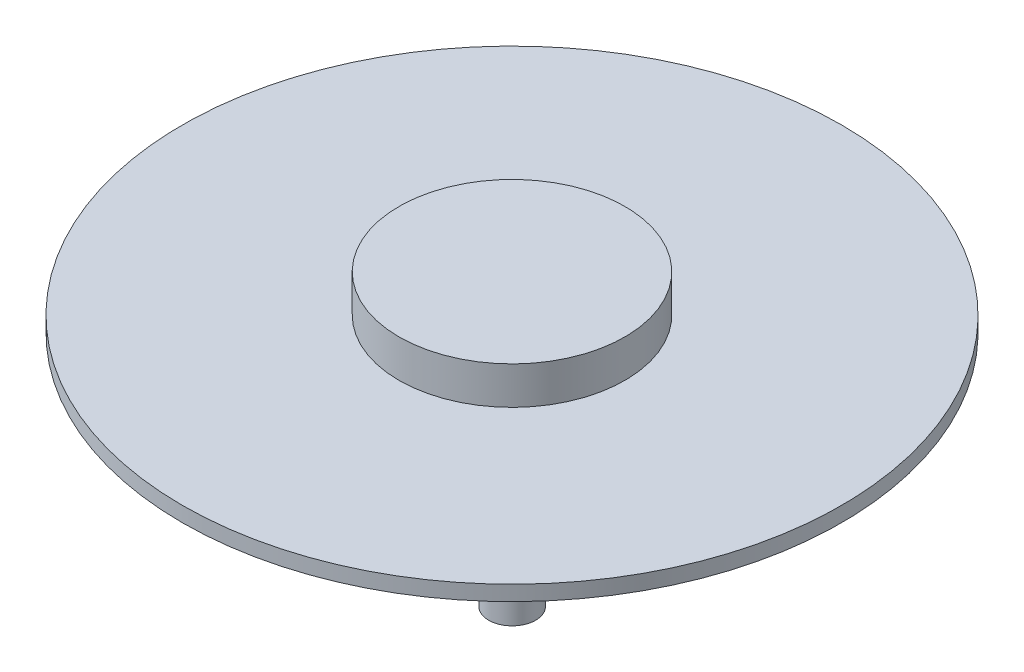
ISO-10303-21;
HEADER;
FILE_DESCRIPTION(('STEP AP214'),'2;1');
FILE_NAME('part.step','',(''),(''),'','','');
FILE_SCHEMA(('AUTOMOTIVE_DESIGN { 1 0 10303 214 1 1 1 1 }'));
ENDSEC;
DATA;
#1=APPLICATION_CONTEXT('core data for automotive mechanical design processes');
#2=APPLICATION_PROTOCOL_DEFINITION('international standard','automotive_design',2000,#1);
#3=PRODUCT_CONTEXT('',#1,'mechanical');
#4=PRODUCT('Part','Part','',(#3));
#5=PRODUCT_RELATED_PRODUCT_CATEGORY('part','',(#4));
#6=PRODUCT_DEFINITION_FORMATION('','',#4);
#7=PRODUCT_DEFINITION_CONTEXT('part definition',#1,'design');
#8=PRODUCT_DEFINITION('design','',#6,#7);
#9=PRODUCT_DEFINITION_SHAPE('','',#8);
#10=(LENGTH_UNIT() NAMED_UNIT(*) SI_UNIT(.MILLI.,.METRE.));
#11=(NAMED_UNIT(*) PLANE_ANGLE_UNIT() SI_UNIT($,.RADIAN.));
#12=(NAMED_UNIT(*) SI_UNIT($,.STERADIAN.) SOLID_ANGLE_UNIT());
#13=UNCERTAINTY_MEASURE_WITH_UNIT(LENGTH_MEASURE(1.E-05),#10,'distance_accuracy_value','');
#14=(GEOMETRIC_REPRESENTATION_CONTEXT(3) GLOBAL_UNCERTAINTY_ASSIGNED_CONTEXT((#13)) GLOBAL_UNIT_ASSIGNED_CONTEXT((#10,
#11,#12)) REPRESENTATION_CONTEXT('',''));
#15=CARTESIAN_POINT('',(0.,0.,0.));
#16=DIRECTION('',(0.,0.,1.));
#17=DIRECTION('',(1.,0.,0.));
#18=AXIS2_PLACEMENT_3D('',#15,#16,#17);
#19=CARTESIAN_POINT('',(21.222,4.,21.205));
#20=DIRECTION('',(0.,-1.,0.));
#21=DIRECTION('',(0.,0.,-1.));
#22=AXIS2_PLACEMENT_3D('',#19,#20,#21);
#23=CYLINDRICAL_SURFACE('',#22,2.5);
#24=CARTESIAN_POINT('',(21.222,4.,21.205));
#25=DIRECTION('',(0.,1.,0.));
#26=DIRECTION('',(0.,0.,1.));
#27=AXIS2_PLACEMENT_3D('',#24,#25,#26);
#28=CIRCLE('',#27,2.5);
#29=CARTESIAN_POINT('',(21.222,4.,23.705));
#30=VERTEX_POINT('',#29);
#31=EDGE_CURVE('E75',#30,#30,#28,.T.);
#32=ORIENTED_EDGE('',*,*,#31,.F.);
#33=EDGE_LOOP('',(#32));
#34=FACE_BOUND('',#33,.T.);
#35=CARTESIAN_POINT('',(21.222,0.,21.205));
#36=DIRECTION('',(0.,1.,0.));
#37=DIRECTION('',(0.,0.,1.));
#38=AXIS2_PLACEMENT_3D('',#35,#36,#37);
#39=CIRCLE('',#38,2.5);
#40=CARTESIAN_POINT('',(21.222,0.,23.705));
#41=VERTEX_POINT('',#40);
#42=EDGE_CURVE('E66',#41,#41,#39,.T.);
#43=ORIENTED_EDGE('',*,*,#42,.T.);
#44=EDGE_LOOP('',(#43));
#45=FACE_BOUND('',#44,.T.);
#46=ADVANCED_FACE('F41',(#34,#45),#23,.T.);
#47=CARTESIAN_POINT('',(21.222,0.,21.205));
#48=DIRECTION('',(0.,1.,0.));
#49=DIRECTION('',(0.,0.,1.));
#50=AXIS2_PLACEMENT_3D('',#47,#48,#49);
#51=PLANE('',#50);
#52=ORIENTED_EDGE('',*,*,#42,.F.);
#53=EDGE_LOOP('',(#52));
#54=FACE_BOUND('',#53,.T.);
#55=ADVANCED_FACE('F99',(#54),#51,.F.);
#56=CARTESIAN_POINT('',(0.,5.6,0.));
#57=DIRECTION('',(0.,-1.,0.));
#58=DIRECTION('',(0.,0.,-1.));
#59=AXIS2_PLACEMENT_3D('',#56,#57,#58);
#60=CYLINDRICAL_SURFACE('',#59,35.);
#61=CARTESIAN_POINT('',(0.,5.6,0.));
#62=DIRECTION('',(0.,1.,0.));
#63=DIRECTION('',(0.,0.,1.));
#64=AXIS2_PLACEMENT_3D('',#61,#62,#63);
#65=CIRCLE('',#64,35.);
#66=CARTESIAN_POINT('',(0.,5.6,35.));
#67=VERTEX_POINT('',#66);
#68=EDGE_CURVE('E67',#67,#67,#65,.T.);
#69=ORIENTED_EDGE('',*,*,#68,.F.);
#70=EDGE_LOOP('',(#69));
#71=FACE_BOUND('',#70,.T.);
#72=CARTESIAN_POINT('',(0.,4.,0.));
#73=DIRECTION('',(0.,1.,0.));
#74=DIRECTION('',(0.,0.,1.));
#75=AXIS2_PLACEMENT_3D('',#72,#73,#74);
#76=CIRCLE('',#75,35.);
#77=CARTESIAN_POINT('',(0.,4.,35.));
#78=VERTEX_POINT('',#77);
#79=EDGE_CURVE('E64',#78,#78,#76,.T.);
#80=ORIENTED_EDGE('',*,*,#79,.T.);
#81=EDGE_LOOP('',(#80));
#82=FACE_BOUND('',#81,.T.);
#83=ADVANCED_FACE('F98',(#71,#82),#60,.T.);
#84=CARTESIAN_POINT('',(0.,5.6,0.));
#85=DIRECTION('',(0.,1.,0.));
#86=DIRECTION('',(0.,0.,1.));
#87=AXIS2_PLACEMENT_3D('',#84,#85,#86);
#88=PLANE('',#87);
#89=CARTESIAN_POINT('',(0.,5.6,0.));
#90=DIRECTION('',(0.,1.,0.));
#91=DIRECTION('',(0.,0.,1.));
#92=AXIS2_PLACEMENT_3D('',#89,#90,#91);
#93=CIRCLE('',#92,12.);
#94=CARTESIAN_POINT('',(0.,5.6,12.));
#95=VERTEX_POINT('',#94);
#96=EDGE_CURVE('E10',#95,#95,#93,.T.);
#97=ORIENTED_EDGE('',*,*,#96,.F.);
#98=EDGE_LOOP('',(#97));
#99=FACE_BOUND('',#98,.T.);
#100=ORIENTED_EDGE('',*,*,#68,.T.);
#101=EDGE_LOOP('',(#100));
#102=FACE_BOUND('',#101,.T.);
#103=ADVANCED_FACE('F90',(#99,#102),#88,.T.);
#104=CARTESIAN_POINT('',(0.,4.,0.));
#105=DIRECTION('',(0.,1.,0.));
#106=DIRECTION('',(0.,0.,1.));
#107=AXIS2_PLACEMENT_3D('',#104,#105,#106);
#108=PLANE('',#107);
#109=CARTESIAN_POINT('',(21.218,4.,-21.209));
#110=DIRECTION('',(0.,1.,0.));
#111=DIRECTION('',(0.,0.,1.));
#112=AXIS2_PLACEMENT_3D('',#109,#110,#111);
#113=CIRCLE('',#112,2.5);
#114=CARTESIAN_POINT('',(21.218,4.,-18.709));
#115=VERTEX_POINT('',#114);
#116=EDGE_CURVE('E42',#115,#115,#113,.F.);
#117=ORIENTED_EDGE('',*,*,#116,.F.);
#118=EDGE_LOOP('',(#117));
#119=FACE_BOUND('',#118,.T.);
#120=CARTESIAN_POINT('',(-21.213,4.,-21.213));
#121=DIRECTION('',(0.,1.,0.));
#122=DIRECTION('',(0.,0.,1.));
#123=AXIS2_PLACEMENT_3D('',#120,#121,#122);
#124=CIRCLE('',#123,2.5);
#125=CARTESIAN_POINT('',(-21.213,4.,-18.713));
#126=VERTEX_POINT('',#125);
#127=EDGE_CURVE('E55',#126,#126,#124,.F.);
#128=ORIENTED_EDGE('',*,*,#127,.F.);
#129=EDGE_LOOP('',(#128));
#130=FACE_BOUND('',#129,.T.);
#131=CARTESIAN_POINT('',(-21.209,4.,21.217));
#132=DIRECTION('',(0.,1.,0.));
#133=DIRECTION('',(0.,0.,1.));
#134=AXIS2_PLACEMENT_3D('',#131,#132,#133);
#135=CIRCLE('',#134,2.5);
#136=CARTESIAN_POINT('',(-21.209,4.,23.717));
#137=VERTEX_POINT('',#136);
#138=EDGE_CURVE('E73',#137,#137,#135,.F.);
#139=ORIENTED_EDGE('',*,*,#138,.F.);
#140=EDGE_LOOP('',(#139));
#141=FACE_BOUND('',#140,.T.);
#142=ORIENTED_EDGE('',*,*,#31,.T.);
#143=EDGE_LOOP('',(#142));
#144=FACE_BOUND('',#143,.T.);
#145=ORIENTED_EDGE('',*,*,#79,.F.);
#146=EDGE_LOOP('',(#145));
#147=FACE_BOUND('',#146,.T.);
#148=ADVANCED_FACE('F83',(#119,#130,#141,#144,#147),#108,.F.);
#149=CARTESIAN_POINT('',(-21.209,4.,21.217));
#150=DIRECTION('',(0.,-1.,0.));
#151=DIRECTION('',(0.,0.,-1.));
#152=AXIS2_PLACEMENT_3D('',#149,#150,#151);
#153=CYLINDRICAL_SURFACE('',#152,2.5);
#154=ORIENTED_EDGE('',*,*,#138,.T.);
#155=EDGE_LOOP('',(#154));
#156=FACE_BOUND('',#155,.T.);
#157=CARTESIAN_POINT('',(-21.209,0.,21.217));
#158=DIRECTION('',(0.,1.,0.));
#159=DIRECTION('',(0.,0.,1.));
#160=AXIS2_PLACEMENT_3D('',#157,#158,#159);
#161=CIRCLE('',#160,2.5);
#162=CARTESIAN_POINT('',(-21.209,0.,23.717));
#163=VERTEX_POINT('',#162);
#164=EDGE_CURVE('E65',#163,#163,#161,.T.);
#165=ORIENTED_EDGE('',*,*,#164,.T.);
#166=EDGE_LOOP('',(#165));
#167=FACE_BOUND('',#166,.T.);
#168=ADVANCED_FACE('F86',(#156,#167),#153,.T.);
#169=CARTESIAN_POINT('',(-21.209,0.,21.217));
#170=DIRECTION('',(0.,1.,0.));
#171=DIRECTION('',(0.,0.,1.));
#172=AXIS2_PLACEMENT_3D('',#169,#170,#171);
#173=PLANE('',#172);
#174=ORIENTED_EDGE('',*,*,#164,.F.);
#175=EDGE_LOOP('',(#174));
#176=FACE_BOUND('',#175,.T.);
#177=ADVANCED_FACE('F146',(#176),#173,.F.);
#178=CARTESIAN_POINT('',(-21.213,4.,-21.213));
#179=DIRECTION('',(0.,-1.,0.));
#180=DIRECTION('',(0.,0.,-1.));
#181=AXIS2_PLACEMENT_3D('',#178,#179,#180);
#182=CYLINDRICAL_SURFACE('',#181,2.5);
#183=ORIENTED_EDGE('',*,*,#127,.T.);
#184=EDGE_LOOP('',(#183));
#185=FACE_BOUND('',#184,.T.);
#186=CARTESIAN_POINT('',(-21.213,0.,-21.213));
#187=DIRECTION('',(0.,1.,0.));
#188=DIRECTION('',(0.,0.,1.));
#189=AXIS2_PLACEMENT_3D('',#186,#187,#188);
#190=CIRCLE('',#189,2.5);
#191=CARTESIAN_POINT('',(-21.213,0.,-18.713));
#192=VERTEX_POINT('',#191);
#193=EDGE_CURVE('E56',#192,#192,#190,.T.);
#194=ORIENTED_EDGE('',*,*,#193,.T.);
#195=EDGE_LOOP('',(#194));
#196=FACE_BOUND('',#195,.T.);
#197=ADVANCED_FACE('F85',(#185,#196),#182,.T.);
#198=CARTESIAN_POINT('',(-21.213,0.,-21.213));
#199=DIRECTION('',(0.,1.,0.));
#200=DIRECTION('',(0.,0.,1.));
#201=AXIS2_PLACEMENT_3D('',#198,#199,#200);
#202=PLANE('',#201);
#203=ORIENTED_EDGE('',*,*,#193,.F.);
#204=EDGE_LOOP('',(#203));
#205=FACE_BOUND('',#204,.T.);
#206=ADVANCED_FACE('F170',(#205),#202,.F.);
#207=CARTESIAN_POINT('',(21.218,4.,-21.209));
#208=DIRECTION('',(0.,-1.,0.));
#209=DIRECTION('',(0.,0.,-1.));
#210=AXIS2_PLACEMENT_3D('',#207,#208,#209);
#211=CYLINDRICAL_SURFACE('',#210,2.5);
#212=ORIENTED_EDGE('',*,*,#116,.T.);
#213=EDGE_LOOP('',(#212));
#214=FACE_BOUND('',#213,.T.);
#215=CARTESIAN_POINT('',(21.218,0.,-21.209));
#216=DIRECTION('',(0.,1.,0.));
#217=DIRECTION('',(0.,0.,1.));
#218=AXIS2_PLACEMENT_3D('',#215,#216,#217);
#219=CIRCLE('',#218,2.5);
#220=CARTESIAN_POINT('',(21.218,0.,-18.709));
#221=VERTEX_POINT('',#220);
#222=EDGE_CURVE('E57',#221,#221,#219,.T.);
#223=ORIENTED_EDGE('',*,*,#222,.T.);
#224=EDGE_LOOP('',(#223));
#225=FACE_BOUND('',#224,.T.);
#226=ADVANCED_FACE('F177',(#214,#225),#211,.T.);
#227=CARTESIAN_POINT('',(21.218,0.,-21.209));
#228=DIRECTION('',(0.,1.,0.));
#229=DIRECTION('',(0.,0.,1.));
#230=AXIS2_PLACEMENT_3D('',#227,#228,#229);
#231=PLANE('',#230);
#232=ORIENTED_EDGE('',*,*,#222,.F.);
#233=EDGE_LOOP('',(#232));
#234=FACE_BOUND('',#233,.T.);
#235=ADVANCED_FACE('F186',(#234),#231,.F.);
#236=CARTESIAN_POINT('',(0.,9.6,0.));
#237=DIRECTION('',(0.,-1.,0.));
#238=DIRECTION('',(0.,0.,-1.));
#239=AXIS2_PLACEMENT_3D('',#236,#237,#238);
#240=CYLINDRICAL_SURFACE('',#239,12.);
#241=CARTESIAN_POINT('',(0.,9.6,0.));
#242=DIRECTION('',(0.,1.,0.));
#243=DIRECTION('',(0.,0.,1.));
#244=AXIS2_PLACEMENT_3D('',#241,#242,#243);
#245=CIRCLE('',#244,12.);
#246=CARTESIAN_POINT('',(0.,9.6,12.));
#247=VERTEX_POINT('',#246);
#248=EDGE_CURVE('E54',#247,#247,#245,.T.);
#249=ORIENTED_EDGE('',*,*,#248,.F.);
#250=EDGE_LOOP('',(#249));
#251=FACE_BOUND('',#250,.T.);
#252=ORIENTED_EDGE('',*,*,#96,.T.);
#253=EDGE_LOOP('',(#252));
#254=FACE_BOUND('',#253,.T.);
#255=ADVANCED_FACE('F193',(#251,#254),#240,.T.);
#256=CARTESIAN_POINT('',(0.,9.6,0.));
#257=DIRECTION('',(0.,1.,0.));
#258=DIRECTION('',(0.,0.,1.));
#259=AXIS2_PLACEMENT_3D('',#256,#257,#258);
#260=PLANE('',#259);
#261=ORIENTED_EDGE('',*,*,#248,.T.);
#262=EDGE_LOOP('',(#261));
#263=FACE_BOUND('',#262,.T.);
#264=ADVANCED_FACE('F204',(#263),#260,.T.);
#265=CLOSED_SHELL('',(#46,#55,#83,#103,#148,#168,#177,#197,#206,#226,#235,#255,#264));
#266=MANIFOLD_SOLID_BREP('B2',#265);
#267=ADVANCED_BREP_SHAPE_REPRESENTATION('',(#18,#266),#14);
#268=SHAPE_DEFINITION_REPRESENTATION(#9,#267);
ENDSEC;
END-ISO-10303-21;
